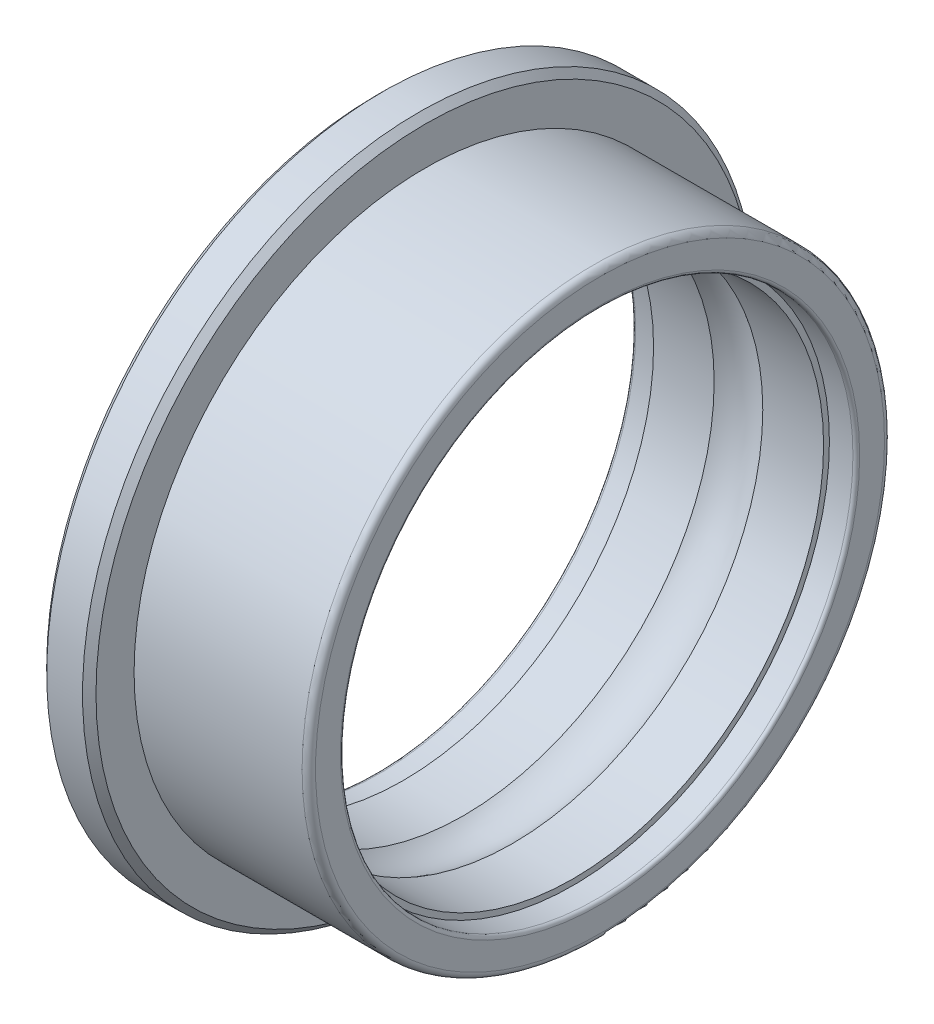
ISO-10303-21;
HEADER;
FILE_DESCRIPTION(('STEP AP214'),'2;1');
FILE_NAME('part.step','',(''),(''),'','','');
FILE_SCHEMA(('AUTOMOTIVE_DESIGN { 1 0 10303 214 1 1 1 1 }'));
ENDSEC;
DATA;
#1=APPLICATION_CONTEXT('core data for automotive mechanical design processes');
#2=APPLICATION_PROTOCOL_DEFINITION('international standard','automotive_design',2000,#1);
#3=PRODUCT_CONTEXT('',#1,'mechanical');
#4=PRODUCT('Part','Part','',(#3));
#5=PRODUCT_RELATED_PRODUCT_CATEGORY('part','',(#4));
#6=PRODUCT_DEFINITION_FORMATION('','',#4);
#7=PRODUCT_DEFINITION_CONTEXT('part definition',#1,'design');
#8=PRODUCT_DEFINITION('design','',#6,#7);
#9=PRODUCT_DEFINITION_SHAPE('','',#8);
#10=(LENGTH_UNIT() NAMED_UNIT(*) SI_UNIT(.MILLI.,.METRE.));
#11=(NAMED_UNIT(*) PLANE_ANGLE_UNIT() SI_UNIT($,.RADIAN.));
#12=(NAMED_UNIT(*) SI_UNIT($,.STERADIAN.) SOLID_ANGLE_UNIT());
#13=UNCERTAINTY_MEASURE_WITH_UNIT(LENGTH_MEASURE(1.E-05),#10,'distance_accuracy_value','');
#14=(GEOMETRIC_REPRESENTATION_CONTEXT(3) GLOBAL_UNCERTAINTY_ASSIGNED_CONTEXT((#13)) GLOBAL_UNIT_ASSIGNED_CONTEXT((#10,
#11,#12)) REPRESENTATION_CONTEXT('',''));
#15=CARTESIAN_POINT('',(0.,0.,0.));
#16=DIRECTION('',(0.,0.,1.));
#17=DIRECTION('',(1.,0.,0.));
#18=AXIS2_PLACEMENT_3D('',#15,#16,#17);
#19=CARTESIAN_POINT('',(0.15,0.,0.));
#20=DIRECTION('',(1.,0.,0.));
#21=DIRECTION('',(0.,0.,-1.));
#22=AXIS2_PLACEMENT_3D('',#19,#20,#21);
#23=CONICAL_SURFACE('',#22,7.5,0.785398163397448);
#24=CARTESIAN_POINT('',(0.,0.,0.));
#25=DIRECTION('',(1.,0.,0.));
#26=DIRECTION('',(0.,0.,-1.));
#27=AXIS2_PLACEMENT_3D('',#24,#25,#26);
#28=CIRCLE('',#27,7.35);
#29=CARTESIAN_POINT('',(0.,0.,-7.35));
#30=VERTEX_POINT('',#29);
#31=EDGE_CURVE('E71',#30,#30,#28,.T.);
#32=ORIENTED_EDGE('',*,*,#31,.T.);
#33=EDGE_LOOP('',(#32));
#34=FACE_BOUND('',#33,.T.);
#35=CARTESIAN_POINT('',(0.15,0.,0.));
#36=DIRECTION('',(1.,0.,0.));
#37=DIRECTION('',(0.,0.,-1.));
#38=AXIS2_PLACEMENT_3D('',#35,#36,#37);
#39=CIRCLE('',#38,7.5);
#40=CARTESIAN_POINT('',(0.15,0.,-7.5));
#41=VERTEX_POINT('',#40);
#42=EDGE_CURVE('E68',#41,#41,#39,.T.);
#43=ORIENTED_EDGE('',*,*,#42,.F.);
#44=EDGE_LOOP('',(#43));
#45=FACE_BOUND('',#44,.T.);
#46=ADVANCED_FACE('F15',(#34,#45),#23,.T.);
#47=CARTESIAN_POINT('',(0.,7.35,0.));
#48=DIRECTION('',(-1.,0.,0.));
#49=DIRECTION('',(0.,0.,1.));
#50=AXIS2_PLACEMENT_3D('',#47,#48,#49);
#51=PLANE('',#50);
#52=CARTESIAN_POINT('',(0.,0.,0.));
#53=DIRECTION('',(1.,0.,0.));
#54=DIRECTION('',(0.,0.,-1.));
#55=AXIS2_PLACEMENT_3D('',#52,#53,#54);
#56=CIRCLE('',#55,5.795);
#57=CARTESIAN_POINT('',(0.,0.,-5.795));
#58=VERTEX_POINT('',#57);
#59=EDGE_CURVE('E65',#58,#58,#56,.T.);
#60=ORIENTED_EDGE('',*,*,#59,.T.);
#61=EDGE_LOOP('',(#60));
#62=FACE_BOUND('',#61,.T.);
#63=ORIENTED_EDGE('',*,*,#31,.F.);
#64=EDGE_LOOP('',(#63));
#65=FACE_BOUND('',#64,.T.);
#66=ADVANCED_FACE('F77',(#62,#65),#51,.T.);
#67=CARTESIAN_POINT('',(4.85,0.,0.));
#68=DIRECTION('',(1.,0.,0.));
#69=DIRECTION('',(0.,0.,-1.));
#70=AXIS2_PLACEMENT_3D('',#67,#68,#69);
#71=CYLINDRICAL_SURFACE('',#70,7.5);
#72=ORIENTED_EDGE('',*,*,#42,.T.);
#73=EDGE_LOOP('',(#72));
#74=FACE_BOUND('',#73,.T.);
#75=CARTESIAN_POINT('',(0.95,0.,0.));
#76=DIRECTION('',(1.,0.,0.));
#77=DIRECTION('',(0.,0.,-1.));
#78=AXIS2_PLACEMENT_3D('',#75,#76,#77);
#79=CIRCLE('',#78,7.5);
#80=CARTESIAN_POINT('',(0.95,0.,-7.5));
#81=VERTEX_POINT('',#80);
#82=EDGE_CURVE('E62',#81,#81,#79,.T.);
#83=ORIENTED_EDGE('',*,*,#82,.F.);
#84=EDGE_LOOP('',(#83));
#85=FACE_BOUND('',#84,.T.);
#86=ADVANCED_FACE('F79',(#74,#85),#71,.T.);
#87=CARTESIAN_POINT('',(0.0749999999999854,0.,0.));
#88=DIRECTION('',(1.,0.,0.));
#89=DIRECTION('',(0.,0.,-1.));
#90=AXIS2_PLACEMENT_3D('',#87,#88,#89);
#91=TOROIDAL_SURFACE('',#90,5.795,0.0749999999999854);
#92=CARTESIAN_POINT('',(0.075,0.,0.));
#93=DIRECTION('',(1.,0.,0.));
#94=DIRECTION('',(0.,0.,-1.));
#95=AXIS2_PLACEMENT_3D('',#92,#93,#94);
#96=CIRCLE('',#95,5.72);
#97=CARTESIAN_POINT('',(0.075,0.,-5.72));
#98=VERTEX_POINT('',#97);
#99=EDGE_CURVE('E59',#98,#98,#96,.T.);
#100=ORIENTED_EDGE('',*,*,#99,.T.);
#101=EDGE_LOOP('',(#100));
#102=FACE_BOUND('',#101,.T.);
#103=ORIENTED_EDGE('',*,*,#59,.F.);
#104=EDGE_LOOP('',(#103));
#105=FACE_BOUND('',#104,.T.);
#106=ADVANCED_FACE('F87',(#102,#105),#91,.T.);
#107=CARTESIAN_POINT('',(1.1,0.,0.));
#108=DIRECTION('',(-1.,0.,0.));
#109=DIRECTION('',(0.,0.,1.));
#110=AXIS2_PLACEMENT_3D('',#107,#108,#109);
#111=CONICAL_SURFACE('',#110,7.35,0.785398163397446);
#112=ORIENTED_EDGE('',*,*,#82,.T.);
#113=EDGE_LOOP('',(#112));
#114=FACE_BOUND('',#113,.T.);
#115=CARTESIAN_POINT('',(1.1,0.,0.));
#116=DIRECTION('',(1.,0.,0.));
#117=DIRECTION('',(0.,0.,-1.));
#118=AXIS2_PLACEMENT_3D('',#115,#116,#117);
#119=CIRCLE('',#118,7.35);
#120=CARTESIAN_POINT('',(1.1,0.,-7.35));
#121=VERTEX_POINT('',#120);
#122=EDGE_CURVE('E56',#121,#121,#119,.T.);
#123=ORIENTED_EDGE('',*,*,#122,.F.);
#124=EDGE_LOOP('',(#123));
#125=FACE_BOUND('',#124,.T.);
#126=ADVANCED_FACE('F94',(#114,#125),#111,.T.);
#127=CARTESIAN_POINT('',(4.85,0.,0.));
#128=DIRECTION('',(1.,0.,0.));
#129=DIRECTION('',(0.,0.,-1.));
#130=AXIS2_PLACEMENT_3D('',#127,#128,#129);
#131=CYLINDRICAL_SURFACE('',#130,5.72);
#132=CARTESIAN_POINT('',(0.605,0.,0.));
#133=DIRECTION('',(1.,0.,0.));
#134=DIRECTION('',(0.,0.,-1.));
#135=AXIS2_PLACEMENT_3D('',#132,#133,#134);
#136=CIRCLE('',#135,5.72);
#137=CARTESIAN_POINT('',(0.605,0.,-5.72));
#138=VERTEX_POINT('',#137);
#139=EDGE_CURVE('E53',#138,#138,#136,.T.);
#140=ORIENTED_EDGE('',*,*,#139,.T.);
#141=EDGE_LOOP('',(#140));
#142=FACE_BOUND('',#141,.T.);
#143=ORIENTED_EDGE('',*,*,#99,.F.);
#144=EDGE_LOOP('',(#143));
#145=FACE_BOUND('',#144,.T.);
#146=ADVANCED_FACE('F98',(#142,#145),#131,.F.);
#147=CARTESIAN_POINT('',(1.1,6.5,0.));
#148=DIRECTION('',(1.,0.,0.));
#149=DIRECTION('',(0.,0.,-1.));
#150=AXIS2_PLACEMENT_3D('',#147,#148,#149);
#151=PLANE('',#150);
#152=ORIENTED_EDGE('',*,*,#122,.T.);
#153=EDGE_LOOP('',(#152));
#154=FACE_BOUND('',#153,.T.);
#155=CARTESIAN_POINT('',(1.1,0.,0.));
#156=DIRECTION('',(1.,0.,0.));
#157=DIRECTION('',(0.,0.,-1.));
#158=AXIS2_PLACEMENT_3D('',#155,#156,#157);
#159=CIRCLE('',#158,6.5);
#160=CARTESIAN_POINT('',(1.1,0.,-6.5));
#161=VERTEX_POINT('',#160);
#162=EDGE_CURVE('E50',#161,#161,#159,.T.);
#163=ORIENTED_EDGE('',*,*,#162,.F.);
#164=EDGE_LOOP('',(#163));
#165=FACE_BOUND('',#164,.T.);
#166=ADVANCED_FACE('F102',(#154,#165),#151,.T.);
#167=CARTESIAN_POINT('',(0.605,5.72,0.));
#168=DIRECTION('',(-1.,0.,0.));
#169=DIRECTION('',(0.,0.,1.));
#170=AXIS2_PLACEMENT_3D('',#167,#168,#169);
#171=PLANE('',#170);
#172=CARTESIAN_POINT('',(0.605,0.,0.));
#173=DIRECTION('',(1.,0.,0.));
#174=DIRECTION('',(0.,0.,-1.));
#175=AXIS2_PLACEMENT_3D('',#172,#173,#174);
#176=CIRCLE('',#175,5.59);
#177=CARTESIAN_POINT('',(0.605,0.,-5.59));
#178=VERTEX_POINT('',#177);
#179=EDGE_CURVE('E47',#178,#178,#176,.T.);
#180=ORIENTED_EDGE('',*,*,#179,.T.);
#181=EDGE_LOOP('',(#180));
#182=FACE_BOUND('',#181,.T.);
#183=ORIENTED_EDGE('',*,*,#139,.F.);
#184=EDGE_LOOP('',(#183));
#185=FACE_BOUND('',#184,.T.);
#186=ADVANCED_FACE('F106',(#182,#185),#171,.T.);
#187=CARTESIAN_POINT('',(4.85,0.,0.));
#188=DIRECTION('',(1.,0.,0.));
#189=DIRECTION('',(0.,0.,-1.));
#190=AXIS2_PLACEMENT_3D('',#187,#188,#189);
#191=CYLINDRICAL_SURFACE('',#190,6.5);
#192=ORIENTED_EDGE('',*,*,#162,.T.);
#193=EDGE_LOOP('',(#192));
#194=FACE_BOUND('',#193,.T.);
#195=CARTESIAN_POINT('',(4.85,0.,0.));
#196=DIRECTION('',(1.,0.,0.));
#197=DIRECTION('',(0.,0.,-1.));
#198=AXIS2_PLACEMENT_3D('',#195,#196,#197);
#199=CIRCLE('',#198,6.5);
#200=CARTESIAN_POINT('',(4.85,0.,-6.5));
#201=VERTEX_POINT('',#200);
#202=EDGE_CURVE('E44',#201,#201,#199,.T.);
#203=ORIENTED_EDGE('',*,*,#202,.F.);
#204=EDGE_LOOP('',(#203));
#205=FACE_BOUND('',#204,.T.);
#206=ADVANCED_FACE('F110',(#194,#205),#191,.T.);
#207=CARTESIAN_POINT('',(4.85,0.,0.));
#208=DIRECTION('',(1.,0.,0.));
#209=DIRECTION('',(0.,0.,-1.));
#210=AXIS2_PLACEMENT_3D('',#207,#208,#209);
#211=CYLINDRICAL_SURFACE('',#210,5.59);
#212=CARTESIAN_POINT('',(1.95741360135,0.,0.));
#213=DIRECTION('',(1.,0.,0.));
#214=DIRECTION('',(0.,0.,-1.));
#215=AXIS2_PLACEMENT_3D('',#212,#213,#214);
#216=CIRCLE('',#215,5.59);
#217=CARTESIAN_POINT('',(1.95741360135,0.,-5.59));
#218=VERTEX_POINT('',#217);
#219=EDGE_CURVE('E41',#218,#218,#216,.T.);
#220=ORIENTED_EDGE('',*,*,#219,.T.);
#221=EDGE_LOOP('',(#220));
#222=FACE_BOUND('',#221,.T.);
#223=ORIENTED_EDGE('',*,*,#179,.F.);
#224=EDGE_LOOP('',(#223));
#225=FACE_BOUND('',#224,.T.);
#226=ADVANCED_FACE('F114',(#222,#225),#211,.F.);
#227=CARTESIAN_POINT('',(4.85000000000006,0.,0.));
#228=DIRECTION('',(1.,0.,0.));
#229=DIRECTION('',(0.,0.,-1.));
#230=AXIS2_PLACEMENT_3D('',#227,#228,#229);
#231=TOROIDAL_SURFACE('',#230,6.35,0.149999999999938);
#232=ORIENTED_EDGE('',*,*,#202,.T.);
#233=EDGE_LOOP('',(#232));
#234=FACE_BOUND('',#233,.T.);
#235=CARTESIAN_POINT('',(5.,0.,0.));
#236=DIRECTION('',(1.,0.,0.));
#237=DIRECTION('',(0.,0.,-1.));
#238=AXIS2_PLACEMENT_3D('',#235,#236,#237);
#239=CIRCLE('',#238,6.35);
#240=CARTESIAN_POINT('',(5.,0.,-6.35));
#241=VERTEX_POINT('',#240);
#242=EDGE_CURVE('E38',#241,#241,#239,.T.);
#243=ORIENTED_EDGE('',*,*,#242,.F.);
#244=EDGE_LOOP('',(#243));
#245=FACE_BOUND('',#244,.T.);
#246=ADVANCED_FACE('F118',(#234,#245),#231,.T.);
#247=CARTESIAN_POINT('',(2.5,0.,0.));
#248=DIRECTION('',(1.,0.,0.));
#249=DIRECTION('',(0.,0.,-1.));
#250=AXIS2_PLACEMENT_3D('',#247,#248,#249);
#251=TOROIDAL_SURFACE('',#250,4.75000000000007,0.99999999999993);
#252=ORIENTED_EDGE('',*,*,#219,.F.);
#253=EDGE_LOOP('',(#252));
#254=FACE_BOUND('',#253,.T.);
#255=CARTESIAN_POINT('',(3.04258639865,0.,0.));
#256=DIRECTION('',(1.,0.,0.));
#257=DIRECTION('',(0.,0.,-1.));
#258=AXIS2_PLACEMENT_3D('',#255,#256,#257);
#259=CIRCLE('',#258,5.59);
#260=CARTESIAN_POINT('',(3.04258639865,0.,-5.59));
#261=VERTEX_POINT('',#260);
#262=EDGE_CURVE('E35',#261,#261,#259,.T.);
#263=ORIENTED_EDGE('',*,*,#262,.T.);
#264=EDGE_LOOP('',(#263));
#265=FACE_BOUND('',#264,.T.);
#266=ADVANCED_FACE('F122',(#254,#265),#251,.F.);
#267=CARTESIAN_POINT('',(5.,5.795,0.));
#268=DIRECTION('',(1.,0.,0.));
#269=DIRECTION('',(0.,0.,-1.));
#270=AXIS2_PLACEMENT_3D('',#267,#268,#269);
#271=PLANE('',#270);
#272=ORIENTED_EDGE('',*,*,#242,.T.);
#273=EDGE_LOOP('',(#272));
#274=FACE_BOUND('',#273,.T.);
#275=CARTESIAN_POINT('',(5.,0.,0.));
#276=DIRECTION('',(1.,0.,0.));
#277=DIRECTION('',(0.,0.,-1.));
#278=AXIS2_PLACEMENT_3D('',#275,#276,#277);
#279=CIRCLE('',#278,5.795);
#280=CARTESIAN_POINT('',(5.,0.,-5.795));
#281=VERTEX_POINT('',#280);
#282=EDGE_CURVE('E30',#281,#281,#279,.T.);
#283=ORIENTED_EDGE('',*,*,#282,.F.);
#284=EDGE_LOOP('',(#283));
#285=FACE_BOUND('',#284,.T.);
#286=ADVANCED_FACE('F126',(#274,#285),#271,.T.);
#287=CARTESIAN_POINT('',(4.85,0.,0.));
#288=DIRECTION('',(1.,0.,0.));
#289=DIRECTION('',(0.,0.,-1.));
#290=AXIS2_PLACEMENT_3D('',#287,#288,#289);
#291=CYLINDRICAL_SURFACE('',#290,5.59);
#292=CARTESIAN_POINT('',(4.4,0.,0.));
#293=DIRECTION('',(1.,0.,0.));
#294=DIRECTION('',(0.,0.,-1.));
#295=AXIS2_PLACEMENT_3D('',#292,#293,#294);
#296=CIRCLE('',#295,5.59);
#297=CARTESIAN_POINT('',(4.4,0.,-5.59));
#298=VERTEX_POINT('',#297);
#299=EDGE_CURVE('E26',#298,#298,#296,.T.);
#300=ORIENTED_EDGE('',*,*,#299,.T.);
#301=EDGE_LOOP('',(#300));
#302=FACE_BOUND('',#301,.T.);
#303=ORIENTED_EDGE('',*,*,#262,.F.);
#304=EDGE_LOOP('',(#303));
#305=FACE_BOUND('',#304,.T.);
#306=ADVANCED_FACE('F130',(#302,#305),#291,.F.);
#307=CARTESIAN_POINT('',(4.925,0.,0.));
#308=DIRECTION('',(1.,0.,0.));
#309=DIRECTION('',(0.,0.,-1.));
#310=AXIS2_PLACEMENT_3D('',#307,#308,#309);
#311=TOROIDAL_SURFACE('',#310,5.795,0.0749999999999709);
#312=ORIENTED_EDGE('',*,*,#282,.T.);
#313=EDGE_LOOP('',(#312));
#314=FACE_BOUND('',#313,.T.);
#315=CARTESIAN_POINT('',(4.925,0.,0.));
#316=DIRECTION('',(1.,0.,0.));
#317=DIRECTION('',(0.,0.,-1.));
#318=AXIS2_PLACEMENT_3D('',#315,#316,#317);
#319=CIRCLE('',#318,5.72);
#320=CARTESIAN_POINT('',(4.925,0.,-5.72));
#321=VERTEX_POINT('',#320);
#322=EDGE_CURVE('E22',#321,#321,#319,.T.);
#323=ORIENTED_EDGE('',*,*,#322,.F.);
#324=EDGE_LOOP('',(#323));
#325=FACE_BOUND('',#324,.T.);
#326=ADVANCED_FACE('F134',(#314,#325),#311,.T.);
#327=CARTESIAN_POINT('',(4.4,5.59,0.));
#328=DIRECTION('',(1.,0.,0.));
#329=DIRECTION('',(0.,0.,-1.));
#330=AXIS2_PLACEMENT_3D('',#327,#328,#329);
#331=PLANE('',#330);
#332=CARTESIAN_POINT('',(4.4,0.,0.));
#333=DIRECTION('',(1.,0.,0.));
#334=DIRECTION('',(0.,0.,-1.));
#335=AXIS2_PLACEMENT_3D('',#332,#333,#334);
#336=CIRCLE('',#335,5.72);
#337=CARTESIAN_POINT('',(4.4,0.,-5.72));
#338=VERTEX_POINT('',#337);
#339=EDGE_CURVE('E10',#338,#338,#336,.T.);
#340=ORIENTED_EDGE('',*,*,#339,.T.);
#341=EDGE_LOOP('',(#340));
#342=FACE_BOUND('',#341,.T.);
#343=ORIENTED_EDGE('',*,*,#299,.F.);
#344=EDGE_LOOP('',(#343));
#345=FACE_BOUND('',#344,.T.);
#346=ADVANCED_FACE('F137',(#342,#345),#331,.T.);
#347=CARTESIAN_POINT('',(4.85,0.,0.));
#348=DIRECTION('',(1.,0.,0.));
#349=DIRECTION('',(0.,0.,-1.));
#350=AXIS2_PLACEMENT_3D('',#347,#348,#349);
#351=CYLINDRICAL_SURFACE('',#350,5.72);
#352=ORIENTED_EDGE('',*,*,#322,.T.);
#353=EDGE_LOOP('',(#352));
#354=FACE_BOUND('',#353,.T.);
#355=ORIENTED_EDGE('',*,*,#339,.F.);
#356=EDGE_LOOP('',(#355));
#357=FACE_BOUND('',#356,.T.);
#358=ADVANCED_FACE('F17',(#354,#357),#351,.F.);
#359=CLOSED_SHELL('',(#46,#66,#86,#106,#126,#146,#166,#186,#206,#226,#246,#266,#286,#306,#326,
#346,#358));
#360=MANIFOLD_SOLID_BREP('B1',#359);
#361=ADVANCED_BREP_SHAPE_REPRESENTATION('',(#18,#360),#14);
#362=SHAPE_DEFINITION_REPRESENTATION(#9,#361);
ENDSEC;
END-ISO-10303-21;
